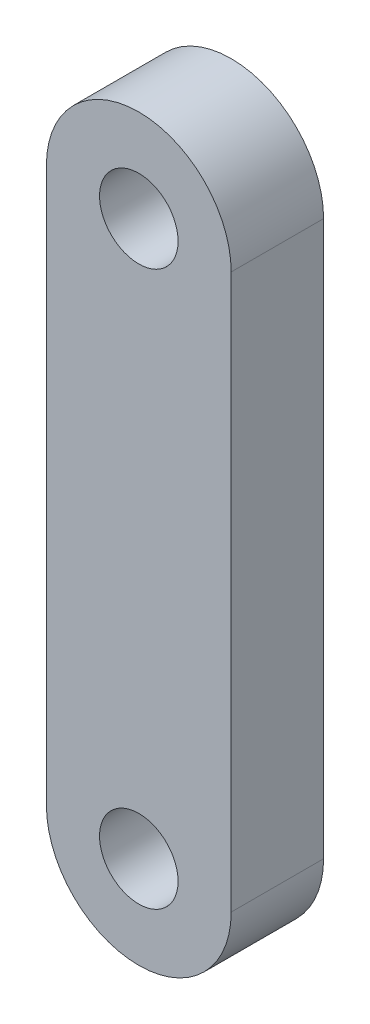
ISO-10303-21;
HEADER;
FILE_DESCRIPTION(('STEP AP214'),'2;1');
FILE_NAME('part.step','',(''),(''),'','','');
FILE_SCHEMA(('AUTOMOTIVE_DESIGN { 1 0 10303 214 1 1 1 1 }'));
ENDSEC;
DATA;
#1=APPLICATION_CONTEXT('core data for automotive mechanical design processes');
#2=APPLICATION_PROTOCOL_DEFINITION('international standard','automotive_design',2000,#1);
#3=PRODUCT_CONTEXT('',#1,'mechanical');
#4=PRODUCT('Part','Part','',(#3));
#5=PRODUCT_RELATED_PRODUCT_CATEGORY('part','',(#4));
#6=PRODUCT_DEFINITION_FORMATION('','',#4);
#7=PRODUCT_DEFINITION_CONTEXT('part definition',#1,'design');
#8=PRODUCT_DEFINITION('design','',#6,#7);
#9=PRODUCT_DEFINITION_SHAPE('','',#8);
#10=(LENGTH_UNIT() NAMED_UNIT(*) SI_UNIT(.MILLI.,.METRE.));
#11=(NAMED_UNIT(*) PLANE_ANGLE_UNIT() SI_UNIT($,.RADIAN.));
#12=(NAMED_UNIT(*) SI_UNIT($,.STERADIAN.) SOLID_ANGLE_UNIT());
#13=UNCERTAINTY_MEASURE_WITH_UNIT(LENGTH_MEASURE(1.E-05),#10,'distance_accuracy_value','');
#14=(GEOMETRIC_REPRESENTATION_CONTEXT(3) GLOBAL_UNCERTAINTY_ASSIGNED_CONTEXT((#13)) GLOBAL_UNIT_ASSIGNED_CONTEXT((#10,
#11,#12)) REPRESENTATION_CONTEXT('',''));
#15=CARTESIAN_POINT('',(0.,0.,0.));
#16=DIRECTION('',(0.,0.,1.));
#17=DIRECTION('',(1.,0.,0.));
#18=AXIS2_PLACEMENT_3D('',#15,#16,#17);
#19=CARTESIAN_POINT('',(0.,0.,4.));
#20=DIRECTION('',(0.,0.,1.));
#21=DIRECTION('',(1.,0.,0.));
#22=AXIS2_PLACEMENT_3D('',#19,#20,#21);
#23=PLANE('',#22);
#24=CARTESIAN_POINT('',(0.,0.,4.));
#25=DIRECTION('',(0.,0.,1.));
#26=DIRECTION('',(1.,0.,0.));
#27=AXIS2_PLACEMENT_3D('',#24,#25,#26);
#28=CIRCLE('',#27,1.7);
#29=CARTESIAN_POINT('',(1.7,0.,4.));
#30=VERTEX_POINT('',#29);
#31=EDGE_CURVE('E104',#30,#30,#28,.T.);
#32=ORIENTED_EDGE('',*,*,#31,.F.);
#33=EDGE_LOOP('',(#32));
#34=FACE_BOUND('',#33,.T.);
#35=CARTESIAN_POINT('',(0.,0.,4.));
#36=DIRECTION('',(0.,0.,1.));
#37=DIRECTION('',(1.,0.,0.));
#38=AXIS2_PLACEMENT_3D('',#35,#36,#37);
#39=CIRCLE('',#38,4.);
#40=CARTESIAN_POINT('',(4.,0.,4.));
#41=VERTEX_POINT('',#40);
#42=CARTESIAN_POINT('',(-4.,0.,4.));
#43=VERTEX_POINT('',#42);
#44=EDGE_CURVE('E89',#41,#43,#39,.T.);
#45=ORIENTED_EDGE('',*,*,#44,.T.);
#46=DIRECTION('',(0.,-1.,0.));
#47=VECTOR('',#46,1.);
#48=CARTESIAN_POINT('',(-4.,0.,4.));
#49=LINE('',#48,#47);
#50=CARTESIAN_POINT('',(-4.,-24.,4.));
#51=VERTEX_POINT('',#50);
#52=EDGE_CURVE('E84',#43,#51,#49,.T.);
#53=ORIENTED_EDGE('',*,*,#52,.T.);
#54=CARTESIAN_POINT('',(0.,-24.,4.));
#55=DIRECTION('',(0.,0.,1.));
#56=DIRECTION('',(1.,0.,0.));
#57=AXIS2_PLACEMENT_3D('',#54,#55,#56);
#58=CIRCLE('',#57,4.);
#59=CARTESIAN_POINT('',(4.00000000000001,-24.,4.));
#60=VERTEX_POINT('',#59);
#61=EDGE_CURVE('E87',#51,#60,#58,.T.);
#62=ORIENTED_EDGE('',*,*,#61,.T.);
#63=DIRECTION('',(0.,1.,0.));
#64=VECTOR('',#63,1.);
#65=CARTESIAN_POINT('',(4.,0.,4.));
#66=LINE('',#65,#64);
#67=EDGE_CURVE('E54',#60,#41,#66,.T.);
#68=ORIENTED_EDGE('',*,*,#67,.T.);
#69=EDGE_LOOP('',(#45,#53,#62,#68));
#70=FACE_BOUND('',#69,.T.);
#71=CARTESIAN_POINT('',(0.,-24.,4.));
#72=DIRECTION('',(0.,0.,1.));
#73=DIRECTION('',(1.,0.,0.));
#74=AXIS2_PLACEMENT_3D('',#71,#72,#73);
#75=CIRCLE('',#74,1.7);
#76=CARTESIAN_POINT('',(1.7,-24.,4.));
#77=VERTEX_POINT('',#76);
#78=EDGE_CURVE('E119',#77,#77,#75,.T.);
#79=ORIENTED_EDGE('',*,*,#78,.F.);
#80=EDGE_LOOP('',(#79));
#81=FACE_BOUND('',#80,.T.);
#82=ADVANCED_FACE('F37',(#34,#70,#81),#23,.T.);
#83=CARTESIAN_POINT('',(0.,0.,0.));
#84=DIRECTION('',(0.,0.,1.));
#85=DIRECTION('',(1.,0.,0.));
#86=AXIS2_PLACEMENT_3D('',#83,#84,#85);
#87=PLANE('',#86);
#88=CARTESIAN_POINT('',(0.,0.,0.));
#89=DIRECTION('',(0.,0.,1.));
#90=DIRECTION('',(1.,0.,0.));
#91=AXIS2_PLACEMENT_3D('',#88,#89,#90);
#92=CIRCLE('',#91,4.);
#93=CARTESIAN_POINT('',(4.,0.,0.));
#94=VERTEX_POINT('',#93);
#95=CARTESIAN_POINT('',(-4.,0.,0.));
#96=VERTEX_POINT('',#95);
#97=EDGE_CURVE('E101',#94,#96,#92,.T.);
#98=ORIENTED_EDGE('',*,*,#97,.F.);
#99=DIRECTION('',(0.,1.,0.));
#100=VECTOR('',#99,1.);
#101=CARTESIAN_POINT('',(4.,0.,0.));
#102=LINE('',#101,#100);
#103=CARTESIAN_POINT('',(4.00000000000001,-24.,0.));
#104=VERTEX_POINT('',#103);
#105=EDGE_CURVE('E77',#104,#94,#102,.T.);
#106=ORIENTED_EDGE('',*,*,#105,.F.);
#107=CARTESIAN_POINT('',(0.,-24.,0.));
#108=DIRECTION('',(0.,0.,1.));
#109=DIRECTION('',(1.,0.,0.));
#110=AXIS2_PLACEMENT_3D('',#107,#108,#109);
#111=CIRCLE('',#110,4.);
#112=CARTESIAN_POINT('',(-4.,-24.,0.));
#113=VERTEX_POINT('',#112);
#114=EDGE_CURVE('E71',#113,#104,#111,.T.);
#115=ORIENTED_EDGE('',*,*,#114,.F.);
#116=DIRECTION('',(0.,-1.,0.));
#117=VECTOR('',#116,1.);
#118=CARTESIAN_POINT('',(-4.,0.,0.));
#119=LINE('',#118,#117);
#120=EDGE_CURVE('E93',#96,#113,#119,.T.);
#121=ORIENTED_EDGE('',*,*,#120,.F.);
#122=EDGE_LOOP('',(#98,#106,#115,#121));
#123=FACE_BOUND('',#122,.T.);
#124=CARTESIAN_POINT('',(0.,0.,0.));
#125=DIRECTION('',(0.,0.,1.));
#126=DIRECTION('',(1.,0.,0.));
#127=AXIS2_PLACEMENT_3D('',#124,#125,#126);
#128=CIRCLE('',#127,1.7);
#129=CARTESIAN_POINT('',(1.7,0.,0.));
#130=VERTEX_POINT('',#129);
#131=EDGE_CURVE('E116',#130,#130,#128,.T.);
#132=ORIENTED_EDGE('',*,*,#131,.T.);
#133=EDGE_LOOP('',(#132));
#134=FACE_BOUND('',#133,.T.);
#135=CARTESIAN_POINT('',(0.,-24.,0.));
#136=DIRECTION('',(0.,0.,1.));
#137=DIRECTION('',(1.,0.,0.));
#138=AXIS2_PLACEMENT_3D('',#135,#136,#137);
#139=CIRCLE('',#138,1.7);
#140=CARTESIAN_POINT('',(1.7,-24.,0.));
#141=VERTEX_POINT('',#140);
#142=EDGE_CURVE('E122',#141,#141,#139,.T.);
#143=ORIENTED_EDGE('',*,*,#142,.T.);
#144=EDGE_LOOP('',(#143));
#145=FACE_BOUND('',#144,.T.);
#146=ADVANCED_FACE('F112',(#123,#134,#145),#87,.F.);
#147=CARTESIAN_POINT('',(0.,0.,4.));
#148=DIRECTION('',(0.,0.,-1.));
#149=DIRECTION('',(-1.,0.,0.));
#150=AXIS2_PLACEMENT_3D('',#147,#148,#149);
#151=CYLINDRICAL_SURFACE('',#150,4.);
#152=ORIENTED_EDGE('',*,*,#97,.T.);
#153=DIRECTION('',(0.,0.,-1.));
#154=VECTOR('',#153,1.);
#155=CARTESIAN_POINT('',(-4.,0.,4.));
#156=LINE('',#155,#154);
#157=EDGE_CURVE('E11',#43,#96,#156,.T.);
#158=ORIENTED_EDGE('',*,*,#157,.F.);
#159=ORIENTED_EDGE('',*,*,#44,.F.);
#160=DIRECTION('',(0.,0.,-1.));
#161=VECTOR('',#160,1.);
#162=CARTESIAN_POINT('',(4.,0.,4.));
#163=LINE('',#162,#161);
#164=EDGE_CURVE('E97',#41,#94,#163,.T.);
#165=ORIENTED_EDGE('',*,*,#164,.T.);
#166=EDGE_LOOP('',(#152,#158,#159,#165));
#167=FACE_BOUND('',#166,.T.);
#168=ADVANCED_FACE('F39',(#167),#151,.T.);
#169=CARTESIAN_POINT('',(-4.,0.,4.));
#170=DIRECTION('',(1.,0.,0.));
#171=DIRECTION('',(0.,1.,0.));
#172=AXIS2_PLACEMENT_3D('',#169,#170,#171);
#173=PLANE('',#172);
#174=ORIENTED_EDGE('',*,*,#120,.T.);
#175=DIRECTION('',(0.,0.,-1.));
#176=VECTOR('',#175,1.);
#177=CARTESIAN_POINT('',(-4.,-24.,4.));
#178=LINE('',#177,#176);
#179=EDGE_CURVE('E46',#51,#113,#178,.T.);
#180=ORIENTED_EDGE('',*,*,#179,.F.);
#181=ORIENTED_EDGE('',*,*,#52,.F.);
#182=ORIENTED_EDGE('',*,*,#157,.T.);
#183=EDGE_LOOP('',(#174,#180,#181,#182));
#184=FACE_BOUND('',#183,.T.);
#185=ADVANCED_FACE('F92',(#184),#173,.F.);
#186=CARTESIAN_POINT('',(0.,-24.,4.));
#187=DIRECTION('',(0.,0.,-1.));
#188=DIRECTION('',(-1.,0.,0.));
#189=AXIS2_PLACEMENT_3D('',#186,#187,#188);
#190=CYLINDRICAL_SURFACE('',#189,4.);
#191=ORIENTED_EDGE('',*,*,#114,.T.);
#192=DIRECTION('',(0.,0.,-1.));
#193=VECTOR('',#192,1.);
#194=CARTESIAN_POINT('',(4.00000000000001,-24.,4.));
#195=LINE('',#194,#193);
#196=EDGE_CURVE('E94',#60,#104,#195,.T.);
#197=ORIENTED_EDGE('',*,*,#196,.F.);
#198=ORIENTED_EDGE('',*,*,#61,.F.);
#199=ORIENTED_EDGE('',*,*,#179,.T.);
#200=EDGE_LOOP('',(#191,#197,#198,#199));
#201=FACE_BOUND('',#200,.T.);
#202=ADVANCED_FACE('F95',(#201),#190,.T.);
#203=CARTESIAN_POINT('',(4.,0.,4.));
#204=DIRECTION('',(-1.,0.,0.));
#205=DIRECTION('',(0.,-1.,0.));
#206=AXIS2_PLACEMENT_3D('',#203,#204,#205);
#207=PLANE('',#206);
#208=ORIENTED_EDGE('',*,*,#105,.T.);
#209=ORIENTED_EDGE('',*,*,#164,.F.);
#210=ORIENTED_EDGE('',*,*,#67,.F.);
#211=ORIENTED_EDGE('',*,*,#196,.T.);
#212=EDGE_LOOP('',(#208,#209,#210,#211));
#213=FACE_BOUND('',#212,.T.);
#214=ADVANCED_FACE('F109',(#213),#207,.F.);
#215=CARTESIAN_POINT('',(0.,0.,4.));
#216=DIRECTION('',(0.,0.,-1.));
#217=DIRECTION('',(-1.,0.,0.));
#218=AXIS2_PLACEMENT_3D('',#215,#216,#217);
#219=CYLINDRICAL_SURFACE('',#218,1.7);
#220=ORIENTED_EDGE('',*,*,#31,.T.);
#221=EDGE_LOOP('',(#220));
#222=FACE_BOUND('',#221,.T.);
#223=ORIENTED_EDGE('',*,*,#131,.F.);
#224=EDGE_LOOP('',(#223));
#225=FACE_BOUND('',#224,.T.);
#226=ADVANCED_FACE('F139',(#222,#225),#219,.F.);
#227=CARTESIAN_POINT('',(0.,-24.,4.));
#228=DIRECTION('',(0.,0.,-1.));
#229=DIRECTION('',(-1.,0.,0.));
#230=AXIS2_PLACEMENT_3D('',#227,#228,#229);
#231=CYLINDRICAL_SURFACE('',#230,1.7);
#232=ORIENTED_EDGE('',*,*,#78,.T.);
#233=EDGE_LOOP('',(#232));
#234=FACE_BOUND('',#233,.T.);
#235=ORIENTED_EDGE('',*,*,#142,.F.);
#236=EDGE_LOOP('',(#235));
#237=FACE_BOUND('',#236,.T.);
#238=ADVANCED_FACE('F128',(#234,#237),#231,.F.);
#239=CLOSED_SHELL('',(#82,#146,#168,#185,#202,#214,#226,#238));
#240=MANIFOLD_SOLID_BREP('B2',#239);
#241=ADVANCED_BREP_SHAPE_REPRESENTATION('',(#18,#240),#14);
#242=SHAPE_DEFINITION_REPRESENTATION(#9,#241);
ENDSEC;
END-ISO-10303-21;
